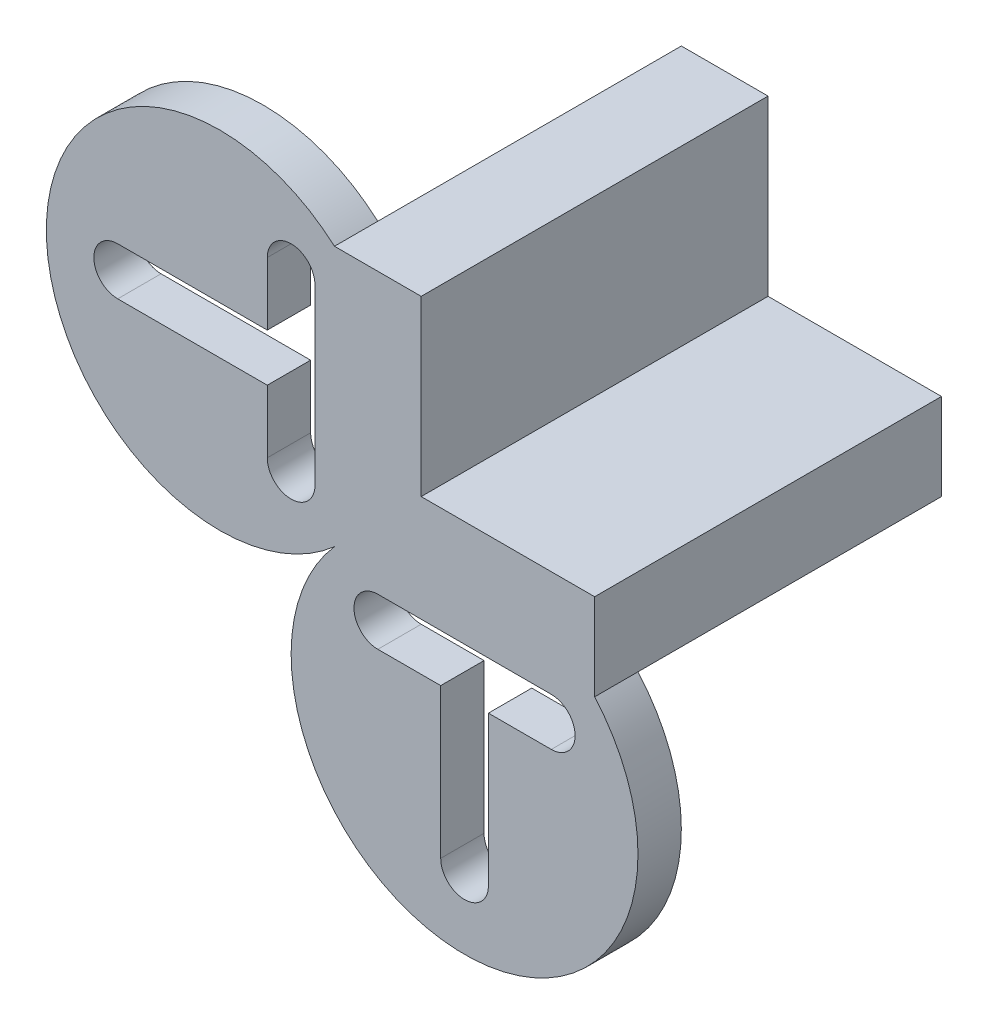
ISO-10303-21;
HEADER;
FILE_DESCRIPTION(('STEP AP214'),'2;1');
FILE_NAME('part.step','',(''),(''),'','','');
FILE_SCHEMA(('AUTOMOTIVE_DESIGN { 1 0 10303 214 1 1 1 1 }'));
ENDSEC;
DATA;
#1=APPLICATION_CONTEXT('core data for automotive mechanical design processes');
#2=APPLICATION_PROTOCOL_DEFINITION('international standard','automotive_design',2000,#1);
#3=PRODUCT_CONTEXT('',#1,'mechanical');
#4=PRODUCT('Part','Part','',(#3));
#5=PRODUCT_RELATED_PRODUCT_CATEGORY('part','',(#4));
#6=PRODUCT_DEFINITION_FORMATION('','',#4);
#7=PRODUCT_DEFINITION_CONTEXT('part definition',#1,'design');
#8=PRODUCT_DEFINITION('design','',#6,#7);
#9=PRODUCT_DEFINITION_SHAPE('','',#8);
#10=(LENGTH_UNIT() NAMED_UNIT(*) SI_UNIT(.MILLI.,.METRE.));
#11=(NAMED_UNIT(*) PLANE_ANGLE_UNIT() SI_UNIT($,.RADIAN.));
#12=(NAMED_UNIT(*) SI_UNIT($,.STERADIAN.) SOLID_ANGLE_UNIT());
#13=UNCERTAINTY_MEASURE_WITH_UNIT(LENGTH_MEASURE(1.E-05),#10,'distance_accuracy_value','');
#14=(GEOMETRIC_REPRESENTATION_CONTEXT(3) GLOBAL_UNCERTAINTY_ASSIGNED_CONTEXT((#13)) GLOBAL_UNIT_ASSIGNED_CONTEXT((#10,
#11,#12)) REPRESENTATION_CONTEXT('',''));
#15=CARTESIAN_POINT('',(0.,0.,0.));
#16=DIRECTION('',(0.,0.,1.));
#17=DIRECTION('',(1.,0.,0.));
#18=AXIS2_PLACEMENT_3D('',#15,#16,#17);
#19=CARTESIAN_POINT('',(-10.,-10.,-40.));
#20=DIRECTION('',(0.,-1.,0.));
#21=DIRECTION('',(0.,0.,-1.));
#22=AXIS2_PLACEMENT_3D('',#19,#20,#21);
#23=PLANE('',#22);
#24=DIRECTION('',(0.,0.,1.));
#25=VECTOR('',#24,1.);
#26=CARTESIAN_POINT('',(20.,-10.,-40.));
#27=LINE('',#26,#25);
#28=CARTESIAN_POINT('',(20.,-10.,-40.));
#29=VERTEX_POINT('',#28);
#30=CARTESIAN_POINT('',(20.,-10.,-5.));
#31=VERTEX_POINT('',#30);
#32=EDGE_CURVE('E398',#29,#31,#27,.T.);
#33=ORIENTED_EDGE('',*,*,#32,.T.);
#34=DIRECTION('',(1.,0.,0.));
#35=VECTOR('',#34,1.);
#36=CARTESIAN_POINT('',(0.,-10.,-5.));
#37=LINE('',#36,#35);
#38=CARTESIAN_POINT('',(-10.,-10.,-5.));
#39=VERTEX_POINT('',#38);
#40=EDGE_CURVE('E351',#39,#31,#37,.T.);
#41=ORIENTED_EDGE('',*,*,#40,.F.);
#42=DIRECTION('',(0.,0.,1.));
#43=VECTOR('',#42,1.);
#44=CARTESIAN_POINT('',(-10.,-10.,-40.));
#45=LINE('',#44,#43);
#46=CARTESIAN_POINT('',(-10.,-10.,-40.));
#47=VERTEX_POINT('',#46);
#48=EDGE_CURVE('E401',#47,#39,#45,.T.);
#49=ORIENTED_EDGE('',*,*,#48,.F.);
#50=DIRECTION('',(1.,0.,0.));
#51=VECTOR('',#50,1.);
#52=CARTESIAN_POINT('',(-10.,-10.,-40.));
#53=LINE('',#52,#51);
#54=EDGE_CURVE('E378',#47,#29,#53,.T.);
#55=ORIENTED_EDGE('',*,*,#54,.T.);
#56=EDGE_LOOP('',(#33,#41,#49,#55));
#57=FACE_BOUND('',#56,.T.);
#58=ADVANCED_FACE('F53',(#57),#23,.T.);
#59=CARTESIAN_POINT('',(-10.,20.,-40.));
#60=DIRECTION('',(-1.,0.,0.));
#61=DIRECTION('',(0.,-1.,0.));
#62=AXIS2_PLACEMENT_3D('',#59,#60,#61);
#63=PLANE('',#62);
#64=ORIENTED_EDGE('',*,*,#48,.T.);
#65=DIRECTION('',(0.,-1.,0.));
#66=VECTOR('',#65,1.);
#67=CARTESIAN_POINT('',(-10.,0.,-5.));
#68=LINE('',#67,#66);
#69=CARTESIAN_POINT('',(-10.,20.,-5.));
#70=VERTEX_POINT('',#69);
#71=EDGE_CURVE('E357',#70,#39,#68,.T.);
#72=ORIENTED_EDGE('',*,*,#71,.F.);
#73=DIRECTION('',(0.,0.,1.));
#74=VECTOR('',#73,1.);
#75=CARTESIAN_POINT('',(-10.,20.,-40.));
#76=LINE('',#75,#74);
#77=CARTESIAN_POINT('',(-10.,20.,-40.));
#78=VERTEX_POINT('',#77);
#79=EDGE_CURVE('E403',#78,#70,#76,.T.);
#80=ORIENTED_EDGE('',*,*,#79,.F.);
#81=DIRECTION('',(0.,-1.,0.));
#82=VECTOR('',#81,1.);
#83=CARTESIAN_POINT('',(-10.,20.,-40.));
#84=LINE('',#83,#82);
#85=EDGE_CURVE('E375',#78,#47,#84,.T.);
#86=ORIENTED_EDGE('',*,*,#85,.T.);
#87=EDGE_LOOP('',(#64,#72,#80,#86));
#88=FACE_BOUND('',#87,.T.);
#89=ADVANCED_FACE('F427',(#88),#63,.T.);
#90=CARTESIAN_POINT('',(0.,0.,-40.));
#91=DIRECTION('',(1.,0.,0.));
#92=DIRECTION('',(0.,0.,-1.));
#93=AXIS2_PLACEMENT_3D('',#90,#91,#92);
#94=PLANE('',#93);
#95=DIRECTION('',(0.,1.,0.));
#96=VECTOR('',#95,1.);
#97=CARTESIAN_POINT('',(0.,0.,0.));
#98=LINE('',#97,#96);
#99=CARTESIAN_POINT('',(0.,0.,0.));
#100=VERTEX_POINT('',#99);
#101=CARTESIAN_POINT('',(0.,20.,0.));
#102=VERTEX_POINT('',#101);
#103=EDGE_CURVE('E365',#100,#102,#98,.T.);
#104=ORIENTED_EDGE('',*,*,#103,.F.);
#105=DIRECTION('',(0.,0.,1.));
#106=VECTOR('',#105,1.);
#107=CARTESIAN_POINT('',(0.,0.,-40.));
#108=LINE('',#107,#106);
#109=CARTESIAN_POINT('',(0.,0.,-40.));
#110=VERTEX_POINT('',#109);
#111=EDGE_CURVE('E12',#110,#100,#108,.T.);
#112=ORIENTED_EDGE('',*,*,#111,.F.);
#113=DIRECTION('',(0.,1.,0.));
#114=VECTOR('',#113,1.);
#115=CARTESIAN_POINT('',(0.,0.,-40.));
#116=LINE('',#115,#114);
#117=CARTESIAN_POINT('',(0.,20.,-40.));
#118=VERTEX_POINT('',#117);
#119=EDGE_CURVE('E368',#110,#118,#116,.T.);
#120=ORIENTED_EDGE('',*,*,#119,.T.);
#121=DIRECTION('',(0.,0.,1.));
#122=VECTOR('',#121,1.);
#123=CARTESIAN_POINT('',(0.,20.,-40.));
#124=LINE('',#123,#122);
#125=EDGE_CURVE('E57',#118,#102,#124,.T.);
#126=ORIENTED_EDGE('',*,*,#125,.T.);
#127=EDGE_LOOP('',(#104,#112,#120,#126));
#128=FACE_BOUND('',#127,.T.);
#129=ADVANCED_FACE('F55',(#128),#94,.T.);
#130=CARTESIAN_POINT('',(20.,0.,-40.));
#131=DIRECTION('',(0.,1.,0.));
#132=DIRECTION('',(0.,0.,1.));
#133=AXIS2_PLACEMENT_3D('',#130,#131,#132);
#134=PLANE('',#133);
#135=DIRECTION('',(-1.,0.,0.));
#136=VECTOR('',#135,1.);
#137=CARTESIAN_POINT('',(20.,0.,0.));
#138=LINE('',#137,#136);
#139=CARTESIAN_POINT('',(20.,0.,0.));
#140=VERTEX_POINT('',#139);
#141=EDGE_CURVE('E372',#140,#100,#138,.T.);
#142=ORIENTED_EDGE('',*,*,#141,.F.);
#143=DIRECTION('',(0.,0.,1.));
#144=VECTOR('',#143,1.);
#145=CARTESIAN_POINT('',(20.,0.,-40.));
#146=LINE('',#145,#144);
#147=CARTESIAN_POINT('',(20.,0.,-40.));
#148=VERTEX_POINT('',#147);
#149=EDGE_CURVE('E62',#148,#140,#146,.T.);
#150=ORIENTED_EDGE('',*,*,#149,.F.);
#151=DIRECTION('',(-1.,0.,0.));
#152=VECTOR('',#151,1.);
#153=CARTESIAN_POINT('',(20.,0.,-40.));
#154=LINE('',#153,#152);
#155=EDGE_CURVE('E384',#148,#110,#154,.T.);
#156=ORIENTED_EDGE('',*,*,#155,.T.);
#157=ORIENTED_EDGE('',*,*,#111,.T.);
#158=EDGE_LOOP('',(#142,#150,#156,#157));
#159=FACE_BOUND('',#158,.T.);
#160=ADVANCED_FACE('F419',(#159),#134,.T.);
#161=CARTESIAN_POINT('',(20.,-10.,-40.));
#162=DIRECTION('',(1.,0.,0.));
#163=DIRECTION('',(0.,0.,-1.));
#164=AXIS2_PLACEMENT_3D('',#161,#162,#163);
#165=PLANE('',#164);
#166=DIRECTION('',(0.,1.,0.));
#167=VECTOR('',#166,1.);
#168=CARTESIAN_POINT('',(20.,-10.,0.));
#169=LINE('',#168,#167);
#170=CARTESIAN_POINT('',(20.,-10.,0.));
#171=VERTEX_POINT('',#170);
#172=EDGE_CURVE('E392',#171,#140,#169,.T.);
#173=ORIENTED_EDGE('',*,*,#172,.F.);
#174=DIRECTION('',(0.,0.,1.));
#175=VECTOR('',#174,1.);
#176=CARTESIAN_POINT('',(20.,-10.,-5.));
#177=LINE('',#176,#175);
#178=EDGE_CURVE('E347',#31,#171,#177,.T.);
#179=ORIENTED_EDGE('',*,*,#178,.F.);
#180=ORIENTED_EDGE('',*,*,#32,.F.);
#181=DIRECTION('',(0.,1.,0.));
#182=VECTOR('',#181,1.);
#183=CARTESIAN_POINT('',(20.,-10.,-40.));
#184=LINE('',#183,#182);
#185=EDGE_CURVE('E381',#29,#148,#184,.T.);
#186=ORIENTED_EDGE('',*,*,#185,.T.);
#187=ORIENTED_EDGE('',*,*,#149,.T.);
#188=EDGE_LOOP('',(#173,#179,#180,#186,#187));
#189=FACE_BOUND('',#188,.T.);
#190=ADVANCED_FACE('F438',(#189),#165,.T.);
#191=CARTESIAN_POINT('',(0.,20.,-40.));
#192=DIRECTION('',(0.,1.,0.));
#193=DIRECTION('',(-1.,0.,0.));
#194=AXIS2_PLACEMENT_3D('',#191,#192,#193);
#195=PLANE('',#194);
#196=DIRECTION('',(-1.,0.,0.));
#197=VECTOR('',#196,1.);
#198=CARTESIAN_POINT('',(0.,20.,0.));
#199=LINE('',#198,#197);
#200=CARTESIAN_POINT('',(-10.,20.,0.));
#201=VERTEX_POINT('',#200);
#202=EDGE_CURVE('E389',#102,#201,#199,.T.);
#203=ORIENTED_EDGE('',*,*,#202,.F.);
#204=ORIENTED_EDGE('',*,*,#125,.F.);
#205=DIRECTION('',(-1.,0.,0.));
#206=VECTOR('',#205,1.);
#207=CARTESIAN_POINT('',(0.,20.,-40.));
#208=LINE('',#207,#206);
#209=EDGE_CURVE('E371',#118,#78,#208,.T.);
#210=ORIENTED_EDGE('',*,*,#209,.T.);
#211=ORIENTED_EDGE('',*,*,#79,.T.);
#212=DIRECTION('',(0.,0.,1.));
#213=VECTOR('',#212,1.);
#214=CARTESIAN_POINT('',(-10.,20.,-5.));
#215=LINE('',#214,#213);
#216=EDGE_CURVE('E362',#70,#201,#215,.T.);
#217=ORIENTED_EDGE('',*,*,#216,.T.);
#218=EDGE_LOOP('',(#203,#204,#210,#211,#217));
#219=FACE_BOUND('',#218,.T.);
#220=ADVANCED_FACE('F411',(#219),#195,.T.);
#221=CARTESIAN_POINT('',(0.,0.,-40.));
#222=DIRECTION('',(0.,0.,1.));
#223=DIRECTION('',(1.,0.,0.));
#224=AXIS2_PLACEMENT_3D('',#221,#222,#223);
#225=PLANE('',#224);
#226=ORIENTED_EDGE('',*,*,#119,.F.);
#227=ORIENTED_EDGE('',*,*,#155,.F.);
#228=ORIENTED_EDGE('',*,*,#185,.F.);
#229=ORIENTED_EDGE('',*,*,#54,.F.);
#230=ORIENTED_EDGE('',*,*,#85,.F.);
#231=ORIENTED_EDGE('',*,*,#209,.F.);
#232=EDGE_LOOP('',(#226,#227,#228,#229,#230,#231));
#233=FACE_BOUND('',#232,.T.);
#234=ADVANCED_FACE('F422',(#233),#225,.F.);
#235=CARTESIAN_POINT('',(0.,0.,0.));
#236=DIRECTION('',(0.,0.,1.));
#237=DIRECTION('',(1.,0.,0.));
#238=AXIS2_PLACEMENT_3D('',#235,#236,#237);
#239=PLANE('',#238);
#240=CARTESIAN_POINT('',(-15.,-5.,0.));
#241=DIRECTION('',(0.,0.,-1.));
#242=DIRECTION('',(-1.,0.,0.));
#243=AXIS2_PLACEMENT_3D('',#240,#241,#242);
#244=CIRCLE('',#243,2.75);
#245=CARTESIAN_POINT('',(-12.25,-5.,0.));
#246=VERTEX_POINT('',#245);
#247=CARTESIAN_POINT('',(-17.75,-5.,0.));
#248=VERTEX_POINT('',#247);
#249=EDGE_CURVE('E216',#246,#248,#244,.T.);
#250=ORIENTED_EDGE('',*,*,#249,.T.);
#251=DIRECTION('',(0.,1.,0.));
#252=VECTOR('',#251,1.);
#253=CARTESIAN_POINT('',(-17.75,-5.,0.));
#254=LINE('',#253,#252);
#255=CARTESIAN_POINT('',(-17.75,2.25000000000001,0.));
#256=VERTEX_POINT('',#255);
#257=EDGE_CURVE('E227',#248,#256,#254,.T.);
#258=ORIENTED_EDGE('',*,*,#257,.T.);
#259=DIRECTION('',(-1.,0.,0.));
#260=VECTOR('',#259,1.);
#261=CARTESIAN_POINT('',(-17.75,2.25000000000001,0.));
#262=LINE('',#261,#260);
#263=CARTESIAN_POINT('',(-35.,2.25000000000001,0.));
#264=VERTEX_POINT('',#263);
#265=EDGE_CURVE('E70',#256,#264,#262,.T.);
#266=ORIENTED_EDGE('',*,*,#265,.T.);
#267=CARTESIAN_POINT('',(-35.,5.00000000000001,0.));
#268=DIRECTION('',(0.,0.,-1.));
#269=DIRECTION('',(-1.,0.,0.));
#270=AXIS2_PLACEMENT_3D('',#267,#268,#269);
#271=CIRCLE('',#270,2.75);
#272=CARTESIAN_POINT('',(-35.,7.75,0.));
#273=VERTEX_POINT('',#272);
#274=EDGE_CURVE('E242',#264,#273,#271,.T.);
#275=ORIENTED_EDGE('',*,*,#274,.T.);
#276=DIRECTION('',(1.,0.,0.));
#277=VECTOR('',#276,1.);
#278=CARTESIAN_POINT('',(-35.,7.75,0.));
#279=LINE('',#278,#277);
#280=CARTESIAN_POINT('',(-17.75,7.75,0.));
#281=VERTEX_POINT('',#280);
#282=EDGE_CURVE('E245',#273,#281,#279,.T.);
#283=ORIENTED_EDGE('',*,*,#282,.T.);
#284=DIRECTION('',(0.,1.,0.));
#285=VECTOR('',#284,1.);
#286=CARTESIAN_POINT('',(-17.75,7.75,0.));
#287=LINE('',#286,#285);
#288=CARTESIAN_POINT('',(-17.75,15.,0.));
#289=VERTEX_POINT('',#288);
#290=EDGE_CURVE('E248',#281,#289,#287,.T.);
#291=ORIENTED_EDGE('',*,*,#290,.T.);
#292=CARTESIAN_POINT('',(-15.,15.,0.));
#293=DIRECTION('',(0.,0.,-1.));
#294=DIRECTION('',(1.,0.,0.));
#295=AXIS2_PLACEMENT_3D('',#292,#293,#294);
#296=CIRCLE('',#295,2.75);
#297=CARTESIAN_POINT('',(-12.25,15.,0.));
#298=VERTEX_POINT('',#297);
#299=EDGE_CURVE('E251',#289,#298,#296,.T.);
#300=ORIENTED_EDGE('',*,*,#299,.T.);
#301=DIRECTION('',(0.,-1.,0.));
#302=VECTOR('',#301,1.);
#303=CARTESIAN_POINT('',(-12.25,-5.,0.));
#304=LINE('',#303,#302);
#305=EDGE_CURVE('E224',#298,#246,#304,.T.);
#306=ORIENTED_EDGE('',*,*,#305,.T.);
#307=EDGE_LOOP('',(#250,#258,#266,#275,#283,#291,#300,#306));
#308=FACE_BOUND('',#307,.T.);
#309=CARTESIAN_POINT('',(-5.,-15.,0.));
#310=DIRECTION('',(0.,0.,-1.));
#311=DIRECTION('',(-1.,0.,0.));
#312=AXIS2_PLACEMENT_3D('',#309,#310,#311);
#313=CIRCLE('',#312,2.75);
#314=CARTESIAN_POINT('',(-5.00000000000002,-17.75,0.));
#315=VERTEX_POINT('',#314);
#316=CARTESIAN_POINT('',(-5.,-12.25,0.));
#317=VERTEX_POINT('',#316);
#318=EDGE_CURVE('E308',#315,#317,#313,.T.);
#319=ORIENTED_EDGE('',*,*,#318,.T.);
#320=DIRECTION('',(1.,0.,0.));
#321=VECTOR('',#320,1.);
#322=CARTESIAN_POINT('',(15.,-12.25,0.));
#323=LINE('',#322,#321);
#324=CARTESIAN_POINT('',(15.,-12.25,0.));
#325=VERTEX_POINT('',#324);
#326=EDGE_CURVE('E342',#317,#325,#323,.T.);
#327=ORIENTED_EDGE('',*,*,#326,.T.);
#328=CARTESIAN_POINT('',(15.,-15.,0.));
#329=DIRECTION('',(0.,0.,-1.));
#330=DIRECTION('',(-1.,0.,0.));
#331=AXIS2_PLACEMENT_3D('',#328,#329,#330);
#332=CIRCLE('',#331,2.75);
#333=CARTESIAN_POINT('',(15.,-17.75,0.));
#334=VERTEX_POINT('',#333);
#335=EDGE_CURVE('E78',#325,#334,#332,.T.);
#336=ORIENTED_EDGE('',*,*,#335,.T.);
#337=DIRECTION('',(-1.,0.,0.));
#338=VECTOR('',#337,1.);
#339=CARTESIAN_POINT('',(7.75,-17.75,0.));
#340=LINE('',#339,#338);
#341=CARTESIAN_POINT('',(7.75,-17.75,0.));
#342=VERTEX_POINT('',#341);
#343=EDGE_CURVE('E338',#334,#342,#340,.T.);
#344=ORIENTED_EDGE('',*,*,#343,.T.);
#345=DIRECTION('',(0.,-1.,0.));
#346=VECTOR('',#345,1.);
#347=CARTESIAN_POINT('',(7.75,-17.75,0.));
#348=LINE('',#347,#346);
#349=CARTESIAN_POINT('',(7.75,-35.,0.));
#350=VERTEX_POINT('',#349);
#351=EDGE_CURVE('E335',#342,#350,#348,.T.);
#352=ORIENTED_EDGE('',*,*,#351,.T.);
#353=CARTESIAN_POINT('',(5.,-35.,0.));
#354=DIRECTION('',(0.,0.,-1.));
#355=DIRECTION('',(1.,0.,0.));
#356=AXIS2_PLACEMENT_3D('',#353,#354,#355);
#357=CIRCLE('',#356,2.75);
#358=CARTESIAN_POINT('',(2.25,-35.,0.));
#359=VERTEX_POINT('',#358);
#360=EDGE_CURVE('E332',#350,#359,#357,.T.);
#361=ORIENTED_EDGE('',*,*,#360,.T.);
#362=DIRECTION('',(0.,1.,0.));
#363=VECTOR('',#362,1.);
#364=CARTESIAN_POINT('',(2.25,-17.75,0.));
#365=LINE('',#364,#363);
#366=CARTESIAN_POINT('',(2.25,-17.75,0.));
#367=VERTEX_POINT('',#366);
#368=EDGE_CURVE('E329',#359,#367,#365,.T.);
#369=ORIENTED_EDGE('',*,*,#368,.T.);
#370=DIRECTION('',(-1.,0.,0.));
#371=VECTOR('',#370,1.);
#372=CARTESIAN_POINT('',(-5.00000000000002,-17.75,0.));
#373=LINE('',#372,#371);
#374=EDGE_CURVE('E289',#367,#315,#373,.T.);
#375=ORIENTED_EDGE('',*,*,#374,.T.);
#376=EDGE_LOOP('',(#319,#327,#336,#344,#352,#361,#369,#375));
#377=FACE_BOUND('',#376,.T.);
#378=ORIENTED_EDGE('',*,*,#103,.T.);
#379=ORIENTED_EDGE('',*,*,#202,.T.);
#380=CARTESIAN_POINT('',(-23.2287565553229,5.,0.));
#381=DIRECTION('',(0.,0.,1.));
#382=DIRECTION('',(1.,0.,0.));
#383=AXIS2_PLACEMENT_3D('',#380,#381,#382);
#384=CIRCLE('',#383,20.);
#385=CARTESIAN_POINT('',(-10.,-10.,0.));
#386=VERTEX_POINT('',#385);
#387=EDGE_CURVE('E353',#386,#201,#384,.F.);
#388=ORIENTED_EDGE('',*,*,#387,.F.);
#389=CARTESIAN_POINT('',(5.,-23.228756555323,0.));
#390=DIRECTION('',(0.,0.,1.));
#391=DIRECTION('',(1.,0.,0.));
#392=AXIS2_PLACEMENT_3D('',#389,#390,#391);
#393=CIRCLE('',#392,20.);
#394=EDGE_CURVE('E274',#171,#386,#393,.F.);
#395=ORIENTED_EDGE('',*,*,#394,.F.);
#396=ORIENTED_EDGE('',*,*,#172,.T.);
#397=ORIENTED_EDGE('',*,*,#141,.T.);
#398=EDGE_LOOP('',(#378,#379,#388,#395,#396,#397));
#399=FACE_BOUND('',#398,.T.);
#400=ADVANCED_FACE('F231',(#308,#377,#399),#239,.T.);
#401=CARTESIAN_POINT('',(-23.2287565553229,5.,-5.));
#402=DIRECTION('',(0.,0.,1.));
#403=DIRECTION('',(1.,0.,0.));
#404=AXIS2_PLACEMENT_3D('',#401,#402,#403);
#405=CYLINDRICAL_SURFACE('',#404,20.);
#406=ORIENTED_EDGE('',*,*,#387,.T.);
#407=ORIENTED_EDGE('',*,*,#216,.F.);
#408=CARTESIAN_POINT('',(-23.2287565553229,5.,-5.));
#409=DIRECTION('',(0.,0.,1.));
#410=DIRECTION('',(1.,0.,0.));
#411=AXIS2_PLACEMENT_3D('',#408,#409,#410);
#412=CIRCLE('',#411,20.);
#413=EDGE_CURVE('E355',#39,#70,#412,.F.);
#414=ORIENTED_EDGE('',*,*,#413,.F.);
#415=DIRECTION('',(0.,0.,1.));
#416=VECTOR('',#415,1.);
#417=CARTESIAN_POINT('',(-10.,-10.,-5.));
#418=LINE('',#417,#416);
#419=EDGE_CURVE('E360',#39,#386,#418,.T.);
#420=ORIENTED_EDGE('',*,*,#419,.T.);
#421=EDGE_LOOP('',(#406,#407,#414,#420));
#422=FACE_BOUND('',#421,.T.);
#423=ADVANCED_FACE('F433',(#422),#405,.T.);
#424=CARTESIAN_POINT('',(0.,0.,-5.));
#425=DIRECTION('',(0.,0.,1.));
#426=DIRECTION('',(1.,0.,0.));
#427=AXIS2_PLACEMENT_3D('',#424,#425,#426);
#428=PLANE('',#427);
#429=DIRECTION('',(0.,1.,0.));
#430=VECTOR('',#429,1.);
#431=CARTESIAN_POINT('',(-17.75,-5.,-5.));
#432=LINE('',#431,#430);
#433=CARTESIAN_POINT('',(-17.75,-5.,-5.));
#434=VERTEX_POINT('',#433);
#435=CARTESIAN_POINT('',(-17.75,2.25000000000001,-5.));
#436=VERTEX_POINT('',#435);
#437=EDGE_CURVE('E255',#434,#436,#432,.T.);
#438=ORIENTED_EDGE('',*,*,#437,.F.);
#439=CARTESIAN_POINT('',(-15.,-5.,-5.));
#440=DIRECTION('',(0.,0.,-1.));
#441=DIRECTION('',(-1.,0.,0.));
#442=AXIS2_PLACEMENT_3D('',#439,#440,#441);
#443=CIRCLE('',#442,2.75);
#444=CARTESIAN_POINT('',(-12.25,-5.,-5.));
#445=VERTEX_POINT('',#444);
#446=EDGE_CURVE('E219',#445,#434,#443,.T.);
#447=ORIENTED_EDGE('',*,*,#446,.F.);
#448=DIRECTION('',(0.,-1.,0.));
#449=VECTOR('',#448,1.);
#450=CARTESIAN_POINT('',(-12.25,-5.,-5.));
#451=LINE('',#450,#449);
#452=CARTESIAN_POINT('',(-12.25,15.,-5.));
#453=VERTEX_POINT('',#452);
#454=EDGE_CURVE('E235',#453,#445,#451,.T.);
#455=ORIENTED_EDGE('',*,*,#454,.F.);
#456=CARTESIAN_POINT('',(-15.,15.,-5.));
#457=DIRECTION('',(0.,0.,-1.));
#458=DIRECTION('',(1.,0.,0.));
#459=AXIS2_PLACEMENT_3D('',#456,#457,#458);
#460=CIRCLE('',#459,2.75);
#461=CARTESIAN_POINT('',(-17.75,15.,-5.));
#462=VERTEX_POINT('',#461);
#463=EDGE_CURVE('E238',#462,#453,#460,.T.);
#464=ORIENTED_EDGE('',*,*,#463,.F.);
#465=DIRECTION('',(0.,1.,0.));
#466=VECTOR('',#465,1.);
#467=CARTESIAN_POINT('',(-17.75,7.75,-5.));
#468=LINE('',#467,#466);
#469=CARTESIAN_POINT('',(-17.75,7.75,-5.));
#470=VERTEX_POINT('',#469);
#471=EDGE_CURVE('E267',#470,#462,#468,.T.);
#472=ORIENTED_EDGE('',*,*,#471,.F.);
#473=DIRECTION('',(1.,0.,0.));
#474=VECTOR('',#473,1.);
#475=CARTESIAN_POINT('',(-35.,7.75,-5.));
#476=LINE('',#475,#474);
#477=CARTESIAN_POINT('',(-35.,7.75,-5.));
#478=VERTEX_POINT('',#477);
#479=EDGE_CURVE('E264',#478,#470,#476,.T.);
#480=ORIENTED_EDGE('',*,*,#479,.F.);
#481=CARTESIAN_POINT('',(-35.,5.00000000000001,-5.));
#482=DIRECTION('',(0.,0.,-1.));
#483=DIRECTION('',(-1.,0.,0.));
#484=AXIS2_PLACEMENT_3D('',#481,#482,#483);
#485=CIRCLE('',#484,2.75);
#486=CARTESIAN_POINT('',(-35.,2.25000000000001,-5.));
#487=VERTEX_POINT('',#486);
#488=EDGE_CURVE('E261',#487,#478,#485,.T.);
#489=ORIENTED_EDGE('',*,*,#488,.F.);
#490=DIRECTION('',(-1.,0.,0.));
#491=VECTOR('',#490,1.);
#492=CARTESIAN_POINT('',(-17.75,2.25000000000001,-5.));
#493=LINE('',#492,#491);
#494=EDGE_CURVE('E258',#436,#487,#493,.T.);
#495=ORIENTED_EDGE('',*,*,#494,.F.);
#496=EDGE_LOOP('',(#438,#447,#455,#464,#472,#480,#489,#495));
#497=FACE_BOUND('',#496,.T.);
#498=ORIENTED_EDGE('',*,*,#413,.T.);
#499=ORIENTED_EDGE('',*,*,#71,.T.);
#500=EDGE_LOOP('',(#498,#499));
#501=FACE_BOUND('',#500,.T.);
#502=ADVANCED_FACE('F431',(#497,#501),#428,.F.);
#503=CARTESIAN_POINT('',(5.,-23.228756555323,-5.));
#504=DIRECTION('',(0.,0.,1.));
#505=DIRECTION('',(1.,0.,0.));
#506=AXIS2_PLACEMENT_3D('',#503,#504,#505);
#507=CYLINDRICAL_SURFACE('',#506,20.);
#508=ORIENTED_EDGE('',*,*,#394,.T.);
#509=ORIENTED_EDGE('',*,*,#419,.F.);
#510=CARTESIAN_POINT('',(5.,-23.228756555323,-5.));
#511=DIRECTION('',(0.,0.,1.));
#512=DIRECTION('',(1.,0.,0.));
#513=AXIS2_PLACEMENT_3D('',#510,#511,#512);
#514=CIRCLE('',#513,20.);
#515=EDGE_CURVE('E349',#31,#39,#514,.F.);
#516=ORIENTED_EDGE('',*,*,#515,.F.);
#517=ORIENTED_EDGE('',*,*,#178,.T.);
#518=EDGE_LOOP('',(#508,#509,#516,#517));
#519=FACE_BOUND('',#518,.T.);
#520=ADVANCED_FACE('F444',(#519),#507,.T.);
#521=CARTESIAN_POINT('',(0.,0.,-5.));
#522=DIRECTION('',(0.,0.,1.));
#523=DIRECTION('',(1.,0.,0.));
#524=AXIS2_PLACEMENT_3D('',#521,#522,#523);
#525=PLANE('',#524);
#526=DIRECTION('',(1.,0.,0.));
#527=VECTOR('',#526,1.);
#528=CARTESIAN_POINT('',(15.,-12.25,-5.));
#529=LINE('',#528,#527);
#530=CARTESIAN_POINT('',(-5.,-12.25,-5.));
#531=VERTEX_POINT('',#530);
#532=CARTESIAN_POINT('',(15.,-12.25,-5.));
#533=VERTEX_POINT('',#532);
#534=EDGE_CURVE('E323',#531,#533,#529,.T.);
#535=ORIENTED_EDGE('',*,*,#534,.F.);
#536=CARTESIAN_POINT('',(-5.,-15.,-5.));
#537=DIRECTION('',(0.,0.,-1.));
#538=DIRECTION('',(-1.,0.,0.));
#539=AXIS2_PLACEMENT_3D('',#536,#537,#538);
#540=CIRCLE('',#539,2.75);
#541=CARTESIAN_POINT('',(-5.00000000000002,-17.75,-5.));
#542=VERTEX_POINT('',#541);
#543=EDGE_CURVE('E256',#542,#531,#540,.T.);
#544=ORIENTED_EDGE('',*,*,#543,.F.);
#545=DIRECTION('',(-1.,0.,0.));
#546=VECTOR('',#545,1.);
#547=CARTESIAN_POINT('',(-5.00000000000002,-17.75,-5.));
#548=LINE('',#547,#546);
#549=CARTESIAN_POINT('',(2.25,-17.75,-5.));
#550=VERTEX_POINT('',#549);
#551=EDGE_CURVE('E304',#550,#542,#548,.T.);
#552=ORIENTED_EDGE('',*,*,#551,.F.);
#553=DIRECTION('',(0.,1.,0.));
#554=VECTOR('',#553,1.);
#555=CARTESIAN_POINT('',(2.25,-17.75,-5.));
#556=LINE('',#555,#554);
#557=CARTESIAN_POINT('',(2.25,-35.,-5.));
#558=VERTEX_POINT('',#557);
#559=EDGE_CURVE('E307',#558,#550,#556,.T.);
#560=ORIENTED_EDGE('',*,*,#559,.F.);
#561=CARTESIAN_POINT('',(5.,-35.,-5.));
#562=DIRECTION('',(0.,0.,-1.));
#563=DIRECTION('',(1.,0.,0.));
#564=AXIS2_PLACEMENT_3D('',#561,#562,#563);
#565=CIRCLE('',#564,2.75);
#566=CARTESIAN_POINT('',(7.75,-35.,-5.));
#567=VERTEX_POINT('',#566);
#568=EDGE_CURVE('E311',#567,#558,#565,.T.);
#569=ORIENTED_EDGE('',*,*,#568,.F.);
#570=DIRECTION('',(0.,-1.,0.));
#571=VECTOR('',#570,1.);
#572=CARTESIAN_POINT('',(7.75,-17.75,-5.));
#573=LINE('',#572,#571);
#574=CARTESIAN_POINT('',(7.75,-17.75,-5.));
#575=VERTEX_POINT('',#574);
#576=EDGE_CURVE('E314',#575,#567,#573,.T.);
#577=ORIENTED_EDGE('',*,*,#576,.F.);
#578=DIRECTION('',(-1.,0.,0.));
#579=VECTOR('',#578,1.);
#580=CARTESIAN_POINT('',(7.75,-17.75,-5.));
#581=LINE('',#580,#579);
#582=CARTESIAN_POINT('',(15.,-17.75,-5.));
#583=VERTEX_POINT('',#582);
#584=EDGE_CURVE('E317',#583,#575,#581,.T.);
#585=ORIENTED_EDGE('',*,*,#584,.F.);
#586=CARTESIAN_POINT('',(15.,-15.,-5.));
#587=DIRECTION('',(0.,0.,-1.));
#588=DIRECTION('',(-1.,0.,0.));
#589=AXIS2_PLACEMENT_3D('',#586,#587,#588);
#590=CIRCLE('',#589,2.75);
#591=EDGE_CURVE('E320',#533,#583,#590,.T.);
#592=ORIENTED_EDGE('',*,*,#591,.F.);
#593=EDGE_LOOP('',(#535,#544,#552,#560,#569,#577,#585,#592));
#594=FACE_BOUND('',#593,.T.);
#595=ORIENTED_EDGE('',*,*,#515,.T.);
#596=ORIENTED_EDGE('',*,*,#40,.T.);
#597=EDGE_LOOP('',(#595,#596));
#598=FACE_BOUND('',#597,.T.);
#599=ADVANCED_FACE('F443',(#594,#598),#525,.F.);
#600=CARTESIAN_POINT('',(-5.,-15.,0.));
#601=DIRECTION('',(0.,0.,-1.));
#602=DIRECTION('',(-1.,0.,0.));
#603=AXIS2_PLACEMENT_3D('',#600,#601,#602);
#604=CYLINDRICAL_SURFACE('',#603,2.75);
#605=ORIENTED_EDGE('',*,*,#543,.T.);
#606=DIRECTION('',(0.,0.,-1.));
#607=VECTOR('',#606,1.);
#608=CARTESIAN_POINT('',(-5.,-12.25,0.));
#609=LINE('',#608,#607);
#610=EDGE_CURVE('E286',#317,#531,#609,.T.);
#611=ORIENTED_EDGE('',*,*,#610,.F.);
#612=ORIENTED_EDGE('',*,*,#318,.F.);
#613=DIRECTION('',(0.,0.,-1.));
#614=VECTOR('',#613,1.);
#615=CARTESIAN_POINT('',(-5.00000000000002,-17.75,0.));
#616=LINE('',#615,#614);
#617=EDGE_CURVE('E302',#315,#542,#616,.T.);
#618=ORIENTED_EDGE('',*,*,#617,.T.);
#619=EDGE_LOOP('',(#605,#611,#612,#618));
#620=FACE_BOUND('',#619,.T.);
#621=ADVANCED_FACE('F451',(#620),#604,.F.);
#622=CARTESIAN_POINT('',(-5.00000000000002,-17.75,0.));
#623=DIRECTION('',(0.,-1.,0.));
#624=DIRECTION('',(0.,0.,-1.));
#625=AXIS2_PLACEMENT_3D('',#622,#623,#624);
#626=PLANE('',#625);
#627=ORIENTED_EDGE('',*,*,#551,.T.);
#628=ORIENTED_EDGE('',*,*,#617,.F.);
#629=ORIENTED_EDGE('',*,*,#374,.F.);
#630=DIRECTION('',(0.,0.,-1.));
#631=VECTOR('',#630,1.);
#632=CARTESIAN_POINT('',(2.25,-17.75,0.));
#633=LINE('',#632,#631);
#634=EDGE_CURVE('E300',#367,#550,#633,.T.);
#635=ORIENTED_EDGE('',*,*,#634,.T.);
#636=EDGE_LOOP('',(#627,#628,#629,#635));
#637=FACE_BOUND('',#636,.T.);
#638=ADVANCED_FACE('F509',(#637),#626,.F.);
#639=CARTESIAN_POINT('',(2.25,-17.75,0.));
#640=DIRECTION('',(-1.,0.,0.));
#641=DIRECTION('',(0.,-1.,0.));
#642=AXIS2_PLACEMENT_3D('',#639,#640,#641);
#643=PLANE('',#642);
#644=ORIENTED_EDGE('',*,*,#559,.T.);
#645=ORIENTED_EDGE('',*,*,#634,.F.);
#646=ORIENTED_EDGE('',*,*,#368,.F.);
#647=DIRECTION('',(0.,0.,-1.));
#648=VECTOR('',#647,1.);
#649=CARTESIAN_POINT('',(2.25,-35.,0.));
#650=LINE('',#649,#648);
#651=EDGE_CURVE('E298',#359,#558,#650,.T.);
#652=ORIENTED_EDGE('',*,*,#651,.T.);
#653=EDGE_LOOP('',(#644,#645,#646,#652));
#654=FACE_BOUND('',#653,.T.);
#655=ADVANCED_FACE('F519',(#654),#643,.F.);
#656=CARTESIAN_POINT('',(5.,-35.,0.));
#657=DIRECTION('',(0.,0.,-1.));
#658=DIRECTION('',(-1.,0.,0.));
#659=AXIS2_PLACEMENT_3D('',#656,#657,#658);
#660=CYLINDRICAL_SURFACE('',#659,2.75);
#661=ORIENTED_EDGE('',*,*,#568,.T.);
#662=ORIENTED_EDGE('',*,*,#651,.F.);
#663=ORIENTED_EDGE('',*,*,#360,.F.);
#664=DIRECTION('',(0.,0.,-1.));
#665=VECTOR('',#664,1.);
#666=CARTESIAN_POINT('',(7.75,-35.,0.));
#667=LINE('',#666,#665);
#668=EDGE_CURVE('E296',#350,#567,#667,.T.);
#669=ORIENTED_EDGE('',*,*,#668,.T.);
#670=EDGE_LOOP('',(#661,#662,#663,#669));
#671=FACE_BOUND('',#670,.T.);
#672=ADVANCED_FACE('F528',(#671),#660,.F.);
#673=CARTESIAN_POINT('',(7.75,-17.75,0.));
#674=DIRECTION('',(1.,0.,0.));
#675=DIRECTION('',(0.,1.,0.));
#676=AXIS2_PLACEMENT_3D('',#673,#674,#675);
#677=PLANE('',#676);
#678=ORIENTED_EDGE('',*,*,#576,.T.);
#679=ORIENTED_EDGE('',*,*,#668,.F.);
#680=ORIENTED_EDGE('',*,*,#351,.F.);
#681=DIRECTION('',(0.,0.,-1.));
#682=VECTOR('',#681,1.);
#683=CARTESIAN_POINT('',(7.75,-17.75,0.));
#684=LINE('',#683,#682);
#685=EDGE_CURVE('E294',#342,#575,#684,.T.);
#686=ORIENTED_EDGE('',*,*,#685,.T.);
#687=EDGE_LOOP('',(#678,#679,#680,#686));
#688=FACE_BOUND('',#687,.T.);
#689=ADVANCED_FACE('F538',(#688),#677,.F.);
#690=CARTESIAN_POINT('',(7.75,-17.75,0.));
#691=DIRECTION('',(0.,-1.,0.));
#692=DIRECTION('',(0.,0.,-1.));
#693=AXIS2_PLACEMENT_3D('',#690,#691,#692);
#694=PLANE('',#693);
#695=ORIENTED_EDGE('',*,*,#584,.T.);
#696=ORIENTED_EDGE('',*,*,#685,.F.);
#697=ORIENTED_EDGE('',*,*,#343,.F.);
#698=DIRECTION('',(0.,0.,-1.));
#699=VECTOR('',#698,1.);
#700=CARTESIAN_POINT('',(15.,-17.75,0.));
#701=LINE('',#700,#699);
#702=EDGE_CURVE('E292',#334,#583,#701,.T.);
#703=ORIENTED_EDGE('',*,*,#702,.T.);
#704=EDGE_LOOP('',(#695,#696,#697,#703));
#705=FACE_BOUND('',#704,.T.);
#706=ADVANCED_FACE('F548',(#705),#694,.F.);
#707=CARTESIAN_POINT('',(15.,-15.,0.));
#708=DIRECTION('',(0.,0.,-1.));
#709=DIRECTION('',(-1.,0.,0.));
#710=AXIS2_PLACEMENT_3D('',#707,#708,#709);
#711=CYLINDRICAL_SURFACE('',#710,2.75);
#712=ORIENTED_EDGE('',*,*,#591,.T.);
#713=ORIENTED_EDGE('',*,*,#702,.F.);
#714=ORIENTED_EDGE('',*,*,#335,.F.);
#715=DIRECTION('',(0.,0.,-1.));
#716=VECTOR('',#715,1.);
#717=CARTESIAN_POINT('',(15.,-12.25,0.));
#718=LINE('',#717,#716);
#719=EDGE_CURVE('E290',#325,#533,#718,.T.);
#720=ORIENTED_EDGE('',*,*,#719,.T.);
#721=EDGE_LOOP('',(#712,#713,#714,#720));
#722=FACE_BOUND('',#721,.T.);
#723=ADVANCED_FACE('F558',(#722),#711,.F.);
#724=CARTESIAN_POINT('',(15.,-12.25,0.));
#725=DIRECTION('',(0.,1.,0.));
#726=DIRECTION('',(0.,0.,1.));
#727=AXIS2_PLACEMENT_3D('',#724,#725,#726);
#728=PLANE('',#727);
#729=ORIENTED_EDGE('',*,*,#534,.T.);
#730=ORIENTED_EDGE('',*,*,#719,.F.);
#731=ORIENTED_EDGE('',*,*,#326,.F.);
#732=ORIENTED_EDGE('',*,*,#610,.T.);
#733=EDGE_LOOP('',(#729,#730,#731,#732));
#734=FACE_BOUND('',#733,.T.);
#735=ADVANCED_FACE('F568',(#734),#728,.F.);
#736=CARTESIAN_POINT('',(-15.,-5.,0.));
#737=DIRECTION('',(0.,0.,-1.));
#738=DIRECTION('',(-1.,0.,0.));
#739=AXIS2_PLACEMENT_3D('',#736,#737,#738);
#740=CYLINDRICAL_SURFACE('',#739,2.75);
#741=ORIENTED_EDGE('',*,*,#446,.T.);
#742=DIRECTION('',(0.,0.,-1.));
#743=VECTOR('',#742,1.);
#744=CARTESIAN_POINT('',(-17.75,-5.,0.));
#745=LINE('',#744,#743);
#746=EDGE_CURVE('E212',#248,#434,#745,.T.);
#747=ORIENTED_EDGE('',*,*,#746,.F.);
#748=ORIENTED_EDGE('',*,*,#249,.F.);
#749=DIRECTION('',(0.,0.,-1.));
#750=VECTOR('',#749,1.);
#751=CARTESIAN_POINT('',(-12.25,-5.,0.));
#752=LINE('',#751,#750);
#753=EDGE_CURVE('E272',#246,#445,#752,.T.);
#754=ORIENTED_EDGE('',*,*,#753,.T.);
#755=EDGE_LOOP('',(#741,#747,#748,#754));
#756=FACE_BOUND('',#755,.T.);
#757=ADVANCED_FACE('F214',(#756),#740,.F.);
#758=CARTESIAN_POINT('',(-12.25,-5.,0.));
#759=DIRECTION('',(1.,0.,0.));
#760=DIRECTION('',(0.,0.,-1.));
#761=AXIS2_PLACEMENT_3D('',#758,#759,#760);
#762=PLANE('',#761);
#763=ORIENTED_EDGE('',*,*,#454,.T.);
#764=ORIENTED_EDGE('',*,*,#753,.F.);
#765=ORIENTED_EDGE('',*,*,#305,.F.);
#766=DIRECTION('',(0.,0.,-1.));
#767=VECTOR('',#766,1.);
#768=CARTESIAN_POINT('',(-12.25,15.,0.));
#769=LINE('',#768,#767);
#770=EDGE_CURVE('E275',#298,#453,#769,.T.);
#771=ORIENTED_EDGE('',*,*,#770,.T.);
#772=EDGE_LOOP('',(#763,#764,#765,#771));
#773=FACE_BOUND('',#772,.T.);
#774=ADVANCED_FACE('F586',(#773),#762,.F.);
#775=CARTESIAN_POINT('',(-15.,15.,0.));
#776=DIRECTION('',(0.,0.,-1.));
#777=DIRECTION('',(-1.,0.,0.));
#778=AXIS2_PLACEMENT_3D('',#775,#776,#777);
#779=CYLINDRICAL_SURFACE('',#778,2.75);
#780=ORIENTED_EDGE('',*,*,#463,.T.);
#781=ORIENTED_EDGE('',*,*,#770,.F.);
#782=ORIENTED_EDGE('',*,*,#299,.F.);
#783=DIRECTION('',(0.,0.,-1.));
#784=VECTOR('',#783,1.);
#785=CARTESIAN_POINT('',(-17.75,15.,0.));
#786=LINE('',#785,#784);
#787=EDGE_CURVE('E277',#289,#462,#786,.T.);
#788=ORIENTED_EDGE('',*,*,#787,.T.);
#789=EDGE_LOOP('',(#780,#781,#782,#788));
#790=FACE_BOUND('',#789,.T.);
#791=ADVANCED_FACE('F595',(#790),#779,.F.);
#792=CARTESIAN_POINT('',(-17.75,7.75,0.));
#793=DIRECTION('',(-1.,0.,0.));
#794=DIRECTION('',(0.,-1.,0.));
#795=AXIS2_PLACEMENT_3D('',#792,#793,#794);
#796=PLANE('',#795);
#797=ORIENTED_EDGE('',*,*,#471,.T.);
#798=ORIENTED_EDGE('',*,*,#787,.F.);
#799=ORIENTED_EDGE('',*,*,#290,.F.);
#800=DIRECTION('',(0.,0.,-1.));
#801=VECTOR('',#800,1.);
#802=CARTESIAN_POINT('',(-17.75,7.75,0.));
#803=LINE('',#802,#801);
#804=EDGE_CURVE('E279',#281,#470,#803,.T.);
#805=ORIENTED_EDGE('',*,*,#804,.T.);
#806=EDGE_LOOP('',(#797,#798,#799,#805));
#807=FACE_BOUND('',#806,.T.);
#808=ADVANCED_FACE('F605',(#807),#796,.F.);
#809=CARTESIAN_POINT('',(-35.,7.75,0.));
#810=DIRECTION('',(0.,1.,0.));
#811=DIRECTION('',(-1.,0.,0.));
#812=AXIS2_PLACEMENT_3D('',#809,#810,#811);
#813=PLANE('',#812);
#814=ORIENTED_EDGE('',*,*,#479,.T.);
#815=ORIENTED_EDGE('',*,*,#804,.F.);
#816=ORIENTED_EDGE('',*,*,#282,.F.);
#817=DIRECTION('',(0.,0.,-1.));
#818=VECTOR('',#817,1.);
#819=CARTESIAN_POINT('',(-35.,7.75,0.));
#820=LINE('',#819,#818);
#821=EDGE_CURVE('E281',#273,#478,#820,.T.);
#822=ORIENTED_EDGE('',*,*,#821,.T.);
#823=EDGE_LOOP('',(#814,#815,#816,#822));
#824=FACE_BOUND('',#823,.T.);
#825=ADVANCED_FACE('F615',(#824),#813,.F.);
#826=CARTESIAN_POINT('',(-35.,5.00000000000001,0.));
#827=DIRECTION('',(0.,0.,-1.));
#828=DIRECTION('',(-1.,0.,0.));
#829=AXIS2_PLACEMENT_3D('',#826,#827,#828);
#830=CYLINDRICAL_SURFACE('',#829,2.75);
#831=ORIENTED_EDGE('',*,*,#488,.T.);
#832=ORIENTED_EDGE('',*,*,#821,.F.);
#833=ORIENTED_EDGE('',*,*,#274,.F.);
#834=DIRECTION('',(0.,0.,-1.));
#835=VECTOR('',#834,1.);
#836=CARTESIAN_POINT('',(-35.,2.25000000000001,0.));
#837=LINE('',#836,#835);
#838=EDGE_CURVE('E283',#264,#487,#837,.T.);
#839=ORIENTED_EDGE('',*,*,#838,.T.);
#840=EDGE_LOOP('',(#831,#832,#833,#839));
#841=FACE_BOUND('',#840,.T.);
#842=ADVANCED_FACE('F625',(#841),#830,.F.);
#843=CARTESIAN_POINT('',(-17.75,2.25000000000001,0.));
#844=DIRECTION('',(0.,-1.,0.));
#845=DIRECTION('',(0.,0.,-1.));
#846=AXIS2_PLACEMENT_3D('',#843,#844,#845);
#847=PLANE('',#846);
#848=ORIENTED_EDGE('',*,*,#494,.T.);
#849=ORIENTED_EDGE('',*,*,#838,.F.);
#850=ORIENTED_EDGE('',*,*,#265,.F.);
#851=DIRECTION('',(0.,0.,-1.));
#852=VECTOR('',#851,1.);
#853=CARTESIAN_POINT('',(-17.75,2.25000000000001,0.));
#854=LINE('',#853,#852);
#855=EDGE_CURVE('E223',#256,#436,#854,.T.);
#856=ORIENTED_EDGE('',*,*,#855,.T.);
#857=EDGE_LOOP('',(#848,#849,#850,#856));
#858=FACE_BOUND('',#857,.T.);
#859=ADVANCED_FACE('F635',(#858),#847,.F.);
#860=CARTESIAN_POINT('',(-17.75,-5.,0.));
#861=DIRECTION('',(-1.,0.,0.));
#862=DIRECTION('',(0.,0.,1.));
#863=AXIS2_PLACEMENT_3D('',#860,#861,#862);
#864=PLANE('',#863);
#865=ORIENTED_EDGE('',*,*,#437,.T.);
#866=ORIENTED_EDGE('',*,*,#855,.F.);
#867=ORIENTED_EDGE('',*,*,#257,.F.);
#868=ORIENTED_EDGE('',*,*,#746,.T.);
#869=EDGE_LOOP('',(#865,#866,#867,#868));
#870=FACE_BOUND('',#869,.T.);
#871=ADVANCED_FACE('F228',(#870),#864,.F.);
#872=CLOSED_SHELL('',(#58,#89,#129,#160,#190,#220,#234,#400,#423,#502,#520,#599,#621,#638,#655,
#672,#689,#706,#723,#735,#757,#774,#791,#808,#825,#842,#859,#871));
#873=MANIFOLD_SOLID_BREP('B2',#872);
#874=ADVANCED_BREP_SHAPE_REPRESENTATION('',(#18,#873),#14);
#875=SHAPE_DEFINITION_REPRESENTATION(#9,#874);
ENDSEC;
END-ISO-10303-21;
